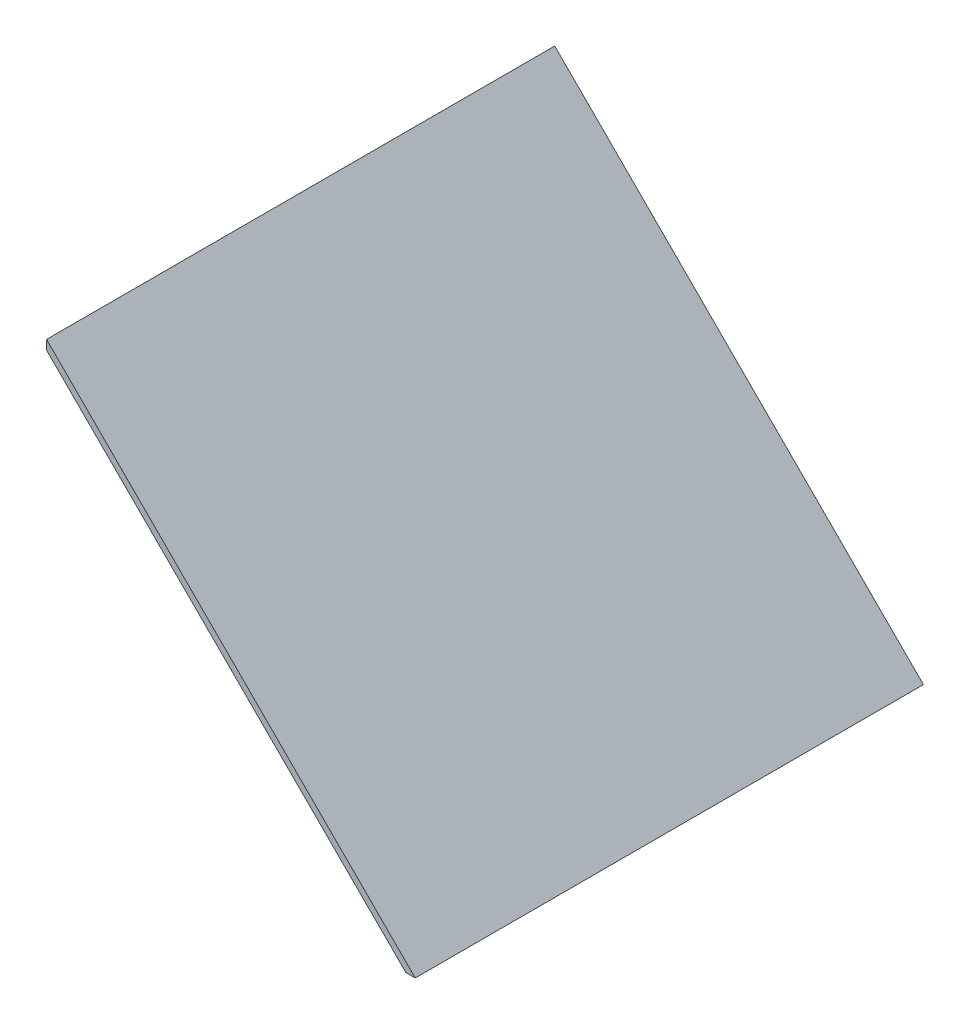
ISO-10303-21;
HEADER;
FILE_DESCRIPTION(('STEP AP214'),'2;1');
FILE_NAME('part.step','',(''),(''),'','','');
FILE_SCHEMA(('AUTOMOTIVE_DESIGN { 1 0 10303 214 1 1 1 1 }'));
ENDSEC;
DATA;
#1=APPLICATION_CONTEXT('core data for automotive mechanical design processes');
#2=APPLICATION_PROTOCOL_DEFINITION('international standard','automotive_design',2000,#1);
#3=PRODUCT_CONTEXT('',#1,'mechanical');
#4=PRODUCT('Part','Part','',(#3));
#5=PRODUCT_RELATED_PRODUCT_CATEGORY('part','',(#4));
#6=PRODUCT_DEFINITION_FORMATION('','',#4);
#7=PRODUCT_DEFINITION_CONTEXT('part definition',#1,'design');
#8=PRODUCT_DEFINITION('design','',#6,#7);
#9=PRODUCT_DEFINITION_SHAPE('','',#8);
#10=(LENGTH_UNIT() NAMED_UNIT(*) SI_UNIT(.MILLI.,.METRE.));
#11=(NAMED_UNIT(*) PLANE_ANGLE_UNIT() SI_UNIT($,.RADIAN.));
#12=(NAMED_UNIT(*) SI_UNIT($,.STERADIAN.) SOLID_ANGLE_UNIT());
#13=UNCERTAINTY_MEASURE_WITH_UNIT(LENGTH_MEASURE(1.E-05),#10,'distance_accuracy_value','');
#14=(GEOMETRIC_REPRESENTATION_CONTEXT(3) GLOBAL_UNCERTAINTY_ASSIGNED_CONTEXT((#13)) GLOBAL_UNIT_ASSIGNED_CONTEXT((#10,
#11,#12)) REPRESENTATION_CONTEXT('',''));
#15=CARTESIAN_POINT('',(0.,0.,0.));
#16=DIRECTION('',(0.,0.,1.));
#17=DIRECTION('',(1.,0.,0.));
#18=AXIS2_PLACEMENT_3D('',#15,#16,#17);
#19=CARTESIAN_POINT('',(1.01599999999998,1.01599999999999,110.));
#20=DIRECTION('',(-0.707106781186546,-0.707106781186549,0.));
#21=DIRECTION('',(0.707106781186549,-0.707106781186546,0.));
#22=AXIS2_PLACEMENT_3D('',#19,#20,#21);
#23=PLANE('',#22);
#24=DIRECTION('',(-0.707106781186549,0.707106781186546,0.));
#25=VECTOR('',#24,1.);
#26=CARTESIAN_POINT('',(1.01599999999998,1.01599999999999,0.));
#27=LINE('',#26,#25);
#28=CARTESIAN_POINT('',(79.8137459305204,-77.7817459305201,0.));
#29=VERTEX_POINT('',#28);
#30=CARTESIAN_POINT('',(0.,2.03199999999996,0.));
#31=VERTEX_POINT('',#30);
#32=EDGE_CURVE('E103',#29,#31,#27,.T.);
#33=ORIENTED_EDGE('',*,*,#32,.T.);
#34=DIRECTION('',(0.,0.,-1.));
#35=VECTOR('',#34,1.);
#36=CARTESIAN_POINT('',(0.,2.03199999999996,110.));
#37=LINE('',#36,#35);
#38=CARTESIAN_POINT('',(0.,2.03199999999996,110.));
#39=VERTEX_POINT('',#38);
#40=EDGE_CURVE('E11',#39,#31,#37,.T.);
#41=ORIENTED_EDGE('',*,*,#40,.F.);
#42=DIRECTION('',(-0.707106781186549,0.707106781186546,0.));
#43=VECTOR('',#42,1.);
#44=CARTESIAN_POINT('',(1.01599999999998,1.01599999999999,110.));
#45=LINE('',#44,#43);
#46=CARTESIAN_POINT('',(79.8137459305204,-77.7817459305201,110.));
#47=VERTEX_POINT('',#46);
#48=EDGE_CURVE('E91',#47,#39,#45,.T.);
#49=ORIENTED_EDGE('',*,*,#48,.F.);
#50=DIRECTION('',(0.,0.,-1.));
#51=VECTOR('',#50,1.);
#52=CARTESIAN_POINT('',(79.8137459305204,-77.7817459305201,110.));
#53=LINE('',#52,#51);
#54=EDGE_CURVE('E99',#47,#29,#53,.T.);
#55=ORIENTED_EDGE('',*,*,#54,.T.);
#56=EDGE_LOOP('',(#33,#41,#49,#55));
#57=FACE_BOUND('',#56,.T.);
#58=ADVANCED_FACE('F40',(#57),#23,.F.);
#59=CARTESIAN_POINT('',(0.,0.,110.));
#60=DIRECTION('',(1.,0.,0.));
#61=DIRECTION('',(0.,1.,0.));
#62=AXIS2_PLACEMENT_3D('',#59,#60,#61);
#63=PLANE('',#62);
#64=DIRECTION('',(0.,-1.,0.));
#65=VECTOR('',#64,1.);
#66=CARTESIAN_POINT('',(0.,0.,0.));
#67=LINE('',#66,#65);
#68=CARTESIAN_POINT('',(0.,0.,0.));
#69=VERTEX_POINT('',#68);
#70=EDGE_CURVE('E95',#31,#69,#67,.T.);
#71=ORIENTED_EDGE('',*,*,#70,.T.);
#72=DIRECTION('',(0.,0.,-1.));
#73=VECTOR('',#72,1.);
#74=CARTESIAN_POINT('',(0.,0.,110.));
#75=LINE('',#74,#73);
#76=CARTESIAN_POINT('',(0.,0.,110.));
#77=VERTEX_POINT('',#76);
#78=EDGE_CURVE('E48',#77,#69,#75,.T.);
#79=ORIENTED_EDGE('',*,*,#78,.F.);
#80=DIRECTION('',(0.,-1.,0.));
#81=VECTOR('',#80,1.);
#82=CARTESIAN_POINT('',(0.,0.,110.));
#83=LINE('',#82,#81);
#84=EDGE_CURVE('E86',#39,#77,#83,.T.);
#85=ORIENTED_EDGE('',*,*,#84,.F.);
#86=ORIENTED_EDGE('',*,*,#40,.T.);
#87=EDGE_LOOP('',(#71,#79,#85,#86));
#88=FACE_BOUND('',#87,.T.);
#89=ADVANCED_FACE('F94',(#88),#63,.F.);
#90=CARTESIAN_POINT('',(0.,0.,110.));
#91=DIRECTION('',(0.707106781186546,0.707106781186549,0.));
#92=DIRECTION('',(-0.707106781186549,0.707106781186546,0.));
#93=AXIS2_PLACEMENT_3D('',#90,#91,#92);
#94=PLANE('',#93);
#95=DIRECTION('',(0.707106781186549,-0.707106781186546,0.));
#96=VECTOR('',#95,1.);
#97=CARTESIAN_POINT('',(0.,0.,0.));
#98=LINE('',#97,#96);
#99=CARTESIAN_POINT('',(77.7817459305204,-77.7817459305201,0.));
#100=VERTEX_POINT('',#99);
#101=EDGE_CURVE('E73',#69,#100,#98,.T.);
#102=ORIENTED_EDGE('',*,*,#101,.T.);
#103=DIRECTION('',(0.,0.,-1.));
#104=VECTOR('',#103,1.);
#105=CARTESIAN_POINT('',(77.7817459305204,-77.7817459305201,110.));
#106=LINE('',#105,#104);
#107=CARTESIAN_POINT('',(77.7817459305204,-77.7817459305201,110.));
#108=VERTEX_POINT('',#107);
#109=EDGE_CURVE('E96',#108,#100,#106,.T.);
#110=ORIENTED_EDGE('',*,*,#109,.F.);
#111=DIRECTION('',(0.707106781186549,-0.707106781186546,0.));
#112=VECTOR('',#111,1.);
#113=CARTESIAN_POINT('',(0.,0.,110.));
#114=LINE('',#113,#112);
#115=EDGE_CURVE('E89',#77,#108,#114,.T.);
#116=ORIENTED_EDGE('',*,*,#115,.F.);
#117=ORIENTED_EDGE('',*,*,#78,.T.);
#118=EDGE_LOOP('',(#102,#110,#116,#117));
#119=FACE_BOUND('',#118,.T.);
#120=ADVANCED_FACE('F97',(#119),#94,.F.);
#121=CARTESIAN_POINT('',(0.,-77.7817459305201,110.));
#122=DIRECTION('',(0.,1.,0.));
#123=DIRECTION('',(0.,0.,1.));
#124=AXIS2_PLACEMENT_3D('',#121,#122,#123);
#125=PLANE('',#124);
#126=DIRECTION('',(1.,0.,0.));
#127=VECTOR('',#126,1.);
#128=CARTESIAN_POINT('',(0.,-77.7817459305201,0.));
#129=LINE('',#128,#127);
#130=EDGE_CURVE('E79',#100,#29,#129,.T.);
#131=ORIENTED_EDGE('',*,*,#130,.T.);
#132=ORIENTED_EDGE('',*,*,#54,.F.);
#133=DIRECTION('',(1.,0.,0.));
#134=VECTOR('',#133,1.);
#135=CARTESIAN_POINT('',(0.,-77.7817459305201,110.));
#136=LINE('',#135,#134);
#137=EDGE_CURVE('E56',#108,#47,#136,.T.);
#138=ORIENTED_EDGE('',*,*,#137,.F.);
#139=ORIENTED_EDGE('',*,*,#109,.T.);
#140=EDGE_LOOP('',(#131,#132,#138,#139));
#141=FACE_BOUND('',#140,.T.);
#142=ADVANCED_FACE('F110',(#141),#125,.F.);
#143=CARTESIAN_POINT('',(0.,0.,110.));
#144=DIRECTION('',(0.,0.,1.));
#145=DIRECTION('',(1.,0.,0.));
#146=AXIS2_PLACEMENT_3D('',#143,#144,#145);
#147=PLANE('',#146);
#148=ORIENTED_EDGE('',*,*,#48,.T.);
#149=ORIENTED_EDGE('',*,*,#84,.T.);
#150=ORIENTED_EDGE('',*,*,#115,.T.);
#151=ORIENTED_EDGE('',*,*,#137,.T.);
#152=EDGE_LOOP('',(#148,#149,#150,#151));
#153=FACE_BOUND('',#152,.T.);
#154=ADVANCED_FACE('F87',(#153),#147,.T.);
#155=CARTESIAN_POINT('',(0.,0.,0.));
#156=DIRECTION('',(0.,0.,1.));
#157=DIRECTION('',(1.,0.,0.));
#158=AXIS2_PLACEMENT_3D('',#155,#156,#157);
#159=PLANE('',#158);
#160=ORIENTED_EDGE('',*,*,#32,.F.);
#161=ORIENTED_EDGE('',*,*,#130,.F.);
#162=ORIENTED_EDGE('',*,*,#101,.F.);
#163=ORIENTED_EDGE('',*,*,#70,.F.);
#164=EDGE_LOOP('',(#160,#161,#162,#163));
#165=FACE_BOUND('',#164,.T.);
#166=ADVANCED_FACE('F113',(#165),#159,.F.);
#167=CLOSED_SHELL('',(#58,#89,#120,#142,#154,#166));
#168=MANIFOLD_SOLID_BREP('B2',#167);
#169=ADVANCED_BREP_SHAPE_REPRESENTATION('',(#18,#168),#14);
#170=SHAPE_DEFINITION_REPRESENTATION(#9,#169);
ENDSEC;
END-ISO-10303-21;
